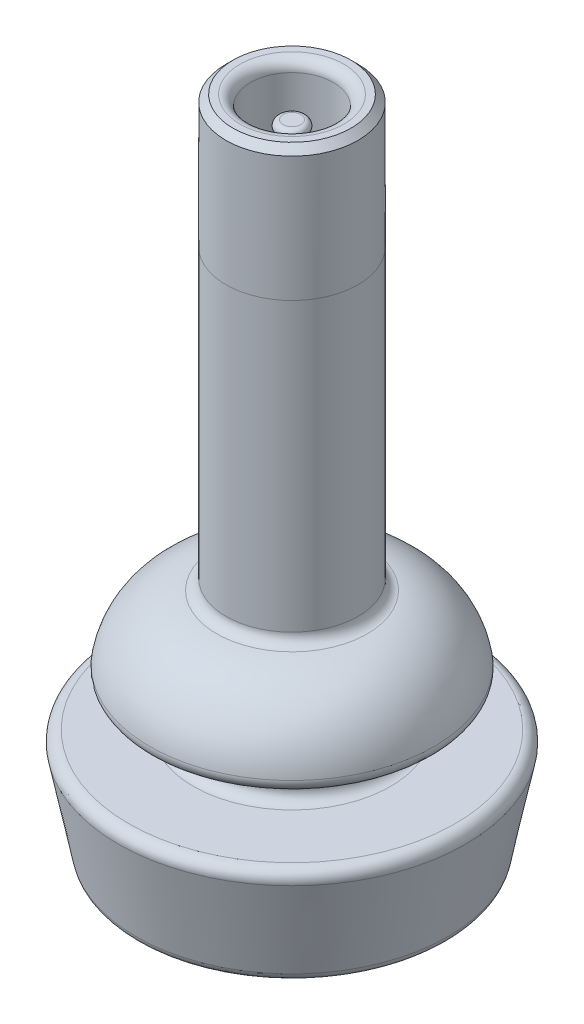
ISO-10303-21;
HEADER;
FILE_DESCRIPTION(('STEP AP214'),'2;1');
FILE_NAME('part.step','',(''),(''),'','','');
FILE_SCHEMA(('AUTOMOTIVE_DESIGN { 1 0 10303 214 1 1 1 1 }'));
ENDSEC;
DATA;
#1=APPLICATION_CONTEXT('core data for automotive mechanical design processes');
#2=APPLICATION_PROTOCOL_DEFINITION('international standard','automotive_design',2000,#1);
#3=PRODUCT_CONTEXT('',#1,'mechanical');
#4=PRODUCT('Part','Part','',(#3));
#5=PRODUCT_RELATED_PRODUCT_CATEGORY('part','',(#4));
#6=PRODUCT_DEFINITION_FORMATION('','',#4);
#7=PRODUCT_DEFINITION_CONTEXT('part definition',#1,'design');
#8=PRODUCT_DEFINITION('design','',#6,#7);
#9=PRODUCT_DEFINITION_SHAPE('','',#8);
#10=(LENGTH_UNIT() NAMED_UNIT(*) SI_UNIT(.MILLI.,.METRE.));
#11=(NAMED_UNIT(*) PLANE_ANGLE_UNIT() SI_UNIT($,.RADIAN.));
#12=(NAMED_UNIT(*) SI_UNIT($,.STERADIAN.) SOLID_ANGLE_UNIT());
#13=UNCERTAINTY_MEASURE_WITH_UNIT(LENGTH_MEASURE(1.E-05),#10,'distance_accuracy_value','');
#14=(GEOMETRIC_REPRESENTATION_CONTEXT(3) GLOBAL_UNCERTAINTY_ASSIGNED_CONTEXT((#13)) GLOBAL_UNIT_ASSIGNED_CONTEXT((#10,
#11,#12)) REPRESENTATION_CONTEXT('',''));
#15=CARTESIAN_POINT('',(0.,0.,0.));
#16=DIRECTION('',(0.,0.,1.));
#17=DIRECTION('',(1.,0.,0.));
#18=AXIS2_PLACEMENT_3D('',#15,#16,#17);
#19=CARTESIAN_POINT('',(0.,45.6565,0.));
#20=DIRECTION('',(0.,-1.,0.));
#21=DIRECTION('',(0.,0.,-1.));
#22=AXIS2_PLACEMENT_3D('',#19,#20,#21);
#23=TOROIDAL_SURFACE('',#22,0.635,0.381000000000002);
#24=CARTESIAN_POINT('',(0.,46.0375,0.));
#25=DIRECTION('',(0.,-1.,0.));
#26=DIRECTION('',(0.,0.,-1.));
#27=AXIS2_PLACEMENT_3D('',#24,#25,#26);
#28=CIRCLE('',#27,0.635);
#29=CARTESIAN_POINT('',(0.,46.0375,-0.635));
#30=VERTEX_POINT('',#29);
#31=EDGE_CURVE('E74',#30,#30,#28,.T.);
#32=ORIENTED_EDGE('',*,*,#31,.T.);
#33=EDGE_LOOP('',(#32));
#34=FACE_BOUND('',#33,.T.);
#35=CARTESIAN_POINT('',(0.,45.3419218069755,0.));
#36=DIRECTION('',(0.,-1.,0.));
#37=DIRECTION('',(0.,0.,-1.));
#38=AXIS2_PLACEMENT_3D('',#35,#36,#37);
#39=CIRCLE('',#38,0.849945482561182);
#40=CARTESIAN_POINT('',(0.,45.3419218069755,-0.849945482561182));
#41=VERTEX_POINT('',#40);
#42=EDGE_CURVE('E68',#41,#41,#39,.T.);
#43=ORIENTED_EDGE('',*,*,#42,.F.);
#44=EDGE_LOOP('',(#43));
#45=FACE_BOUND('',#44,.T.);
#46=ADVANCED_FACE('F45',(#34,#45),#23,.T.);
#47=CARTESIAN_POINT('',(0.,45.0215,0.));
#48=DIRECTION('',(0.,1.,0.));
#49=DIRECTION('',(0.,0.,1.));
#50=AXIS2_PLACEMENT_3D('',#47,#48,#49);
#51=CONICAL_SURFACE('',#50,0.381,0.971379127257785);
#52=ORIENTED_EDGE('',*,*,#42,.T.);
#53=EDGE_LOOP('',(#52));
#54=FACE_BOUND('',#53,.T.);
#55=CARTESIAN_POINT('',(0.,45.0215,0.));
#56=DIRECTION('',(0.,-1.,0.));
#57=DIRECTION('',(0.,0.,-1.));
#58=AXIS2_PLACEMENT_3D('',#55,#56,#57);
#59=CIRCLE('',#58,0.381);
#60=CARTESIAN_POINT('',(0.,45.0215,-0.381));
#61=VERTEX_POINT('',#60);
#62=EDGE_CURVE('E71',#61,#61,#59,.T.);
#63=ORIENTED_EDGE('',*,*,#62,.F.);
#64=EDGE_LOOP('',(#63));
#65=FACE_BOUND('',#64,.T.);
#66=ADVANCED_FACE('F102',(#54,#65),#51,.T.);
#67=CARTESIAN_POINT('',(0.,38.1,0.));
#68=DIRECTION('',(0.,-1.,0.));
#69=DIRECTION('',(0.,0.,-1.));
#70=AXIS2_PLACEMENT_3D('',#67,#68,#69);
#71=CYLINDRICAL_SURFACE('',#70,0.381);
#72=CARTESIAN_POINT('',(0.,38.862,0.));
#73=DIRECTION('',(0.,1.,0.));
#74=DIRECTION('',(0.,0.,1.));
#75=AXIS2_PLACEMENT_3D('',#72,#73,#74);
#76=CIRCLE('',#75,0.381);
#77=CARTESIAN_POINT('',(0.,38.862,0.381));
#78=VERTEX_POINT('',#77);
#79=EDGE_CURVE('E65',#78,#78,#76,.F.);
#80=ORIENTED_EDGE('',*,*,#79,.F.);
#81=EDGE_LOOP('',(#80));
#82=FACE_BOUND('',#81,.T.);
#83=ORIENTED_EDGE('',*,*,#62,.T.);
#84=EDGE_LOOP('',(#83));
#85=FACE_BOUND('',#84,.T.);
#86=ADVANCED_FACE('F108',(#82,#85),#71,.T.);
#87=CARTESIAN_POINT('',(0.,46.0375,0.));
#88=DIRECTION('',(0.,1.,0.));
#89=DIRECTION('',(0.,0.,1.));
#90=AXIS2_PLACEMENT_3D('',#87,#88,#89);
#91=PLANE('',#90);
#92=ORIENTED_EDGE('',*,*,#31,.F.);
#93=EDGE_LOOP('',(#92));
#94=FACE_BOUND('',#93,.T.);
#95=ADVANCED_FACE('F137',(#94),#91,.T.);
#96=CARTESIAN_POINT('',(1.7145,38.862,0.));
#97=DIRECTION('',(0.,1.,0.));
#98=DIRECTION('',(0.,0.,1.));
#99=AXIS2_PLACEMENT_3D('',#96,#97,#98);
#100=PLANE('',#99);
#101=ORIENTED_EDGE('',*,*,#79,.T.);
#102=EDGE_LOOP('',(#101));
#103=FACE_BOUND('',#102,.T.);
#104=CARTESIAN_POINT('',(0.,38.862,0.));
#105=DIRECTION('',(0.,-1.,0.));
#106=DIRECTION('',(0.,0.,-1.));
#107=AXIS2_PLACEMENT_3D('',#104,#105,#106);
#108=CIRCLE('',#107,1.7145);
#109=CARTESIAN_POINT('',(0.,38.862,-1.7145));
#110=VERTEX_POINT('',#109);
#111=EDGE_CURVE('E77',#110,#110,#108,.T.);
#112=ORIENTED_EDGE('',*,*,#111,.F.);
#113=EDGE_LOOP('',(#112));
#114=FACE_BOUND('',#113,.T.);
#115=ADVANCED_FACE('F131',(#103,#114),#100,.T.);
#116=CARTESIAN_POINT('',(0.,40.132,0.));
#117=DIRECTION('',(0.,-1.,0.));
#118=DIRECTION('',(0.,0.,-1.));
#119=AXIS2_PLACEMENT_3D('',#116,#117,#118);
#120=TOROIDAL_SURFACE('',#119,1.7145,1.27);
#121=ORIENTED_EDGE('',*,*,#111,.T.);
#122=EDGE_LOOP('',(#121));
#123=FACE_BOUND('',#122,.T.);
#124=CARTESIAN_POINT('',(0.,40.132,0.));
#125=DIRECTION('',(0.,-1.,0.));
#126=DIRECTION('',(0.,0.,-1.));
#127=AXIS2_PLACEMENT_3D('',#124,#125,#126);
#128=CIRCLE('',#127,2.9845);
#129=CARTESIAN_POINT('',(0.,40.132,-2.9845));
#130=VERTEX_POINT('',#129);
#131=EDGE_CURVE('E80',#130,#130,#128,.T.);
#132=ORIENTED_EDGE('',*,*,#131,.F.);
#133=EDGE_LOOP('',(#132));
#134=FACE_BOUND('',#133,.T.);
#135=ADVANCED_FACE('F126',(#123,#134),#120,.F.);
#136=CARTESIAN_POINT('',(0.,0.,0.));
#137=DIRECTION('',(0.,-1.,0.));
#138=DIRECTION('',(0.,0.,-1.));
#139=AXIS2_PLACEMENT_3D('',#136,#137,#138);
#140=CYLINDRICAL_SURFACE('',#139,2.9845);
#141=CARTESIAN_POINT('',(0.,46.863,0.));
#142=DIRECTION('',(0.,1.,0.));
#143=DIRECTION('',(0.,0.,1.));
#144=AXIS2_PLACEMENT_3D('',#141,#142,#143);
#145=CIRCLE('',#144,2.9845);
#146=CARTESIAN_POINT('',(0.,46.863,2.9845));
#147=VERTEX_POINT('',#146);
#148=EDGE_CURVE('E56',#147,#147,#145,.T.);
#149=ORIENTED_EDGE('',*,*,#148,.T.);
#150=EDGE_LOOP('',(#149));
#151=FACE_BOUND('',#150,.T.);
#152=ORIENTED_EDGE('',*,*,#131,.T.);
#153=EDGE_LOOP('',(#152));
#154=FACE_BOUND('',#153,.T.);
#155=ADVANCED_FACE('F99',(#151,#154),#140,.F.);
#156=CARTESIAN_POINT('',(4.7625,47.625,0.));
#157=DIRECTION('',(0.,1.,0.));
#158=DIRECTION('',(0.,0.,1.));
#159=AXIS2_PLACEMENT_3D('',#156,#157,#158);
#160=PLANE('',#159);
#161=CARTESIAN_POINT('',(0.,47.625,0.));
#162=DIRECTION('',(0.,1.,0.));
#163=DIRECTION('',(0.,0.,1.));
#164=AXIS2_PLACEMENT_3D('',#161,#162,#163);
#165=CIRCLE('',#164,4.2545);
#166=CARTESIAN_POINT('',(0.,47.625,4.2545));
#167=VERTEX_POINT('',#166);
#168=EDGE_CURVE('E11',#167,#167,#165,.T.);
#169=ORIENTED_EDGE('',*,*,#168,.T.);
#170=EDGE_LOOP('',(#169));
#171=FACE_BOUND('',#170,.T.);
#172=CARTESIAN_POINT('',(0.,47.625,0.));
#173=DIRECTION('',(0.,1.,0.));
#174=DIRECTION('',(0.,0.,1.));
#175=AXIS2_PLACEMENT_3D('',#172,#173,#174);
#176=CIRCLE('',#175,3.7465);
#177=CARTESIAN_POINT('',(0.,47.625,3.7465));
#178=VERTEX_POINT('',#177);
#179=EDGE_CURVE('E60',#178,#178,#176,.F.);
#180=ORIENTED_EDGE('',*,*,#179,.T.);
#181=EDGE_LOOP('',(#180));
#182=FACE_BOUND('',#181,.T.);
#183=ADVANCED_FACE('F91',(#171,#182),#160,.T.);
#184=CARTESIAN_POINT('',(0.,0.,0.));
#185=DIRECTION('',(0.,-1.,0.));
#186=DIRECTION('',(0.,0.,-1.));
#187=AXIS2_PLACEMENT_3D('',#184,#185,#186);
#188=CYLINDRICAL_SURFACE('',#187,4.7625);
#189=CARTESIAN_POINT('',(0.,47.117,0.));
#190=DIRECTION('',(0.,1.,0.));
#191=DIRECTION('',(0.,0.,1.));
#192=AXIS2_PLACEMENT_3D('',#189,#190,#191);
#193=CIRCLE('',#192,4.7625);
#194=CARTESIAN_POINT('',(0.,47.117,4.7625));
#195=VERTEX_POINT('',#194);
#196=EDGE_CURVE('E52',#195,#195,#193,.F.);
#197=ORIENTED_EDGE('',*,*,#196,.T.);
#198=EDGE_LOOP('',(#197));
#199=FACE_BOUND('',#198,.T.);
#200=CARTESIAN_POINT('',(0.,38.1,0.));
#201=DIRECTION('',(0.,-1.,0.));
#202=DIRECTION('',(0.,0.,-1.));
#203=AXIS2_PLACEMENT_3D('',#200,#201,#202);
#204=CIRCLE('',#203,4.7625);
#205=CARTESIAN_POINT('',(0.,38.1,-4.7625));
#206=VERTEX_POINT('',#205);
#207=EDGE_CURVE('E83',#206,#206,#204,.T.);
#208=ORIENTED_EDGE('',*,*,#207,.F.);
#209=EDGE_LOOP('',(#208));
#210=FACE_BOUND('',#209,.T.);
#211=ADVANCED_FACE('F89',(#199,#210),#188,.T.);
#212=CARTESIAN_POINT('',(0.381000000000001,38.1,0.));
#213=DIRECTION('',(0.,-1.,0.));
#214=DIRECTION('',(0.,0.,-1.));
#215=AXIS2_PLACEMENT_3D('',#212,#213,#214);
#216=PLANE('',#215);
#217=ORIENTED_EDGE('',*,*,#207,.T.);
#218=EDGE_LOOP('',(#217));
#219=FACE_BOUND('',#218,.T.);
#220=ADVANCED_FACE('F87',(#219),#216,.T.);
#221=CARTESIAN_POINT('',(0.,46.863,0.));
#222=DIRECTION('',(0.,1.,0.));
#223=DIRECTION('',(0.,0.,1.));
#224=AXIS2_PLACEMENT_3D('',#221,#222,#223);
#225=TOROIDAL_SURFACE('',#224,3.7465,0.762);
#226=ORIENTED_EDGE('',*,*,#148,.F.);
#227=EDGE_LOOP('',(#226));
#228=FACE_BOUND('',#227,.T.);
#229=ORIENTED_EDGE('',*,*,#179,.F.);
#230=EDGE_LOOP('',(#229));
#231=FACE_BOUND('',#230,.T.);
#232=ADVANCED_FACE('F97',(#228,#231),#225,.T.);
#233=CARTESIAN_POINT('',(0.,47.117,0.));
#234=DIRECTION('',(0.,-1.,0.));
#235=DIRECTION('',(0.,0.,-1.));
#236=AXIS2_PLACEMENT_3D('',#233,#234,#235);
#237=CONICAL_SURFACE('',#236,4.7625,0.785398163397452);
#238=ORIENTED_EDGE('',*,*,#168,.F.);
#239=EDGE_LOOP('',(#238));
#240=FACE_BOUND('',#239,.T.);
#241=ORIENTED_EDGE('',*,*,#196,.F.);
#242=EDGE_LOOP('',(#241));
#243=FACE_BOUND('',#242,.T.);
#244=ADVANCED_FACE('F47',(#240,#243),#237,.T.);
#245=CLOSED_SHELL('',(#46,#66,#86,#95,#115,#135,#155,#183,#211,#220,#232,#244));
#246=MANIFOLD_SOLID_BREP('B2',#245);
#247=CARTESIAN_POINT('',(0.,38.1,0.));
#248=DIRECTION('',(0.,1.,0.));
#249=DIRECTION('',(0.,0.,1.));
#250=AXIS2_PLACEMENT_3D('',#247,#248,#249);
#251=PLANE('',#250);
#252=CARTESIAN_POINT('',(0.,38.1,0.));
#253=DIRECTION('',(0.,-1.,0.));
#254=DIRECTION('',(0.,0.,-1.));
#255=AXIS2_PLACEMENT_3D('',#252,#253,#254);
#256=CIRCLE('',#255,4.7625);
#257=CARTESIAN_POINT('',(0.,38.1,-4.7625));
#258=VERTEX_POINT('',#257);
#259=EDGE_CURVE('E283',#258,#258,#256,.T.);
#260=ORIENTED_EDGE('',*,*,#259,.F.);
#261=EDGE_LOOP('',(#260));
#262=FACE_BOUND('',#261,.T.);
#263=ADVANCED_FACE('F239',(#262),#251,.T.);
#264=CARTESIAN_POINT('',(0.,0.,0.));
#265=DIRECTION('',(0.,-1.,0.));
#266=DIRECTION('',(0.,0.,-1.));
#267=AXIS2_PLACEMENT_3D('',#264,#265,#266);
#268=CYLINDRICAL_SURFACE('',#267,4.7625);
#269=CARTESIAN_POINT('',(0.,17.3846319391814,0.));
#270=DIRECTION('',(0.,-1.,0.));
#271=DIRECTION('',(0.,0.,-1.));
#272=AXIS2_PLACEMENT_3D('',#269,#270,#271);
#273=CIRCLE('',#272,4.7625);
#274=CARTESIAN_POINT('',(0.,17.3846319391814,-4.7625));
#275=VERTEX_POINT('',#274);
#276=EDGE_CURVE('E254',#275,#275,#273,.F.);
#277=ORIENTED_EDGE('',*,*,#276,.T.);
#278=EDGE_LOOP('',(#277));
#279=FACE_BOUND('',#278,.T.);
#280=ORIENTED_EDGE('',*,*,#259,.T.);
#281=EDGE_LOOP('',(#280));
#282=FACE_BOUND('',#281,.T.);
#283=ADVANCED_FACE('F287',(#279,#282),#268,.T.);
#284=CARTESIAN_POINT('',(0.,11.1125,0.));
#285=DIRECTION('',(0.,-1.,0.));
#286=DIRECTION('',(0.,0.,-1.));
#287=AXIS2_PLACEMENT_3D('',#284,#285,#286);
#288=DEGENERATE_TOROIDAL_SURFACE('',#287,4.7625,5.55625,.T.);
#289=CARTESIAN_POINT('',(0.,16.6281939163656,0.));
#290=DIRECTION('',(0.,-1.,0.));
#291=DIRECTION('',(0.,0.,-1.));
#292=AXIS2_PLACEMENT_3D('',#289,#290,#291);
#293=CIRCLE('',#292,5.43260050251257);
#294=CARTESIAN_POINT('',(0.,16.6281939163656,-5.43260050251257));
#295=VERTEX_POINT('',#294);
#296=EDGE_CURVE('E259',#295,#295,#293,.T.);
#297=ORIENTED_EDGE('',*,*,#296,.T.);
#298=EDGE_LOOP('',(#297));
#299=FACE_BOUND('',#298,.T.);
#300=CARTESIAN_POINT('',(0.,11.9956125827815,0.));
#301=DIRECTION('',(0.,-1.,0.));
#302=DIRECTION('',(0.,0.,-1.));
#303=AXIS2_PLACEMENT_3D('',#300,#301,#302);
#304=CIRCLE('',#303,10.2481199493433);
#305=CARTESIAN_POINT('',(0.,11.9956125827815,-10.2481199493433));
#306=VERTEX_POINT('',#305);
#307=EDGE_CURVE('E262',#306,#306,#304,.F.);
#308=ORIENTED_EDGE('',*,*,#307,.T.);
#309=EDGE_LOOP('',(#308));
#310=FACE_BOUND('',#309,.T.);
#311=ADVANCED_FACE('F294',(#299,#310),#288,.T.);
#312=CARTESIAN_POINT('',(10.31875,11.1125,0.));
#313=DIRECTION('',(0.,-1.,0.));
#314=DIRECTION('',(0.,0.,-1.));
#315=AXIS2_PLACEMENT_3D('',#312,#313,#314);
#316=PLANE('',#315);
#317=CARTESIAN_POINT('',(0.,11.1125,0.));
#318=DIRECTION('',(0.,-1.,0.));
#319=DIRECTION('',(0.,0.,-1.));
#320=AXIS2_PLACEMENT_3D('',#317,#318,#319);
#321=CIRCLE('',#320,7.112);
#322=CARTESIAN_POINT('',(0.,11.1125,-7.112));
#323=VERTEX_POINT('',#322);
#324=EDGE_CURVE('E271',#323,#323,#321,.F.);
#325=ORIENTED_EDGE('',*,*,#324,.T.);
#326=EDGE_LOOP('',(#325));
#327=FACE_BOUND('',#326,.T.);
#328=CARTESIAN_POINT('',(0.,11.1125,0.));
#329=DIRECTION('',(0.,-1.,0.));
#330=DIRECTION('',(0.,0.,-1.));
#331=AXIS2_PLACEMENT_3D('',#328,#329,#330);
#332=CIRCLE('',#331,9.49580635629049);
#333=CARTESIAN_POINT('',(0.,11.1125,-9.49580635629049));
#334=VERTEX_POINT('',#333);
#335=EDGE_CURVE('E274',#334,#334,#332,.T.);
#336=ORIENTED_EDGE('',*,*,#335,.T.);
#337=EDGE_LOOP('',(#336));
#338=FACE_BOUND('',#337,.T.);
#339=ADVANCED_FACE('F336',(#327,#338),#316,.T.);
#340=CARTESIAN_POINT('',(0.,0.,0.));
#341=DIRECTION('',(0.,-1.,0.));
#342=DIRECTION('',(0.,0.,-1.));
#343=AXIS2_PLACEMENT_3D('',#340,#341,#342);
#344=CYLINDRICAL_SURFACE('',#343,6.35);
#345=CARTESIAN_POINT('',(0.,10.3505,0.));
#346=DIRECTION('',(0.,-1.,0.));
#347=DIRECTION('',(0.,0.,-1.));
#348=AXIS2_PLACEMENT_3D('',#345,#346,#347);
#349=CIRCLE('',#348,6.35);
#350=CARTESIAN_POINT('',(0.,10.3505,-6.35));
#351=VERTEX_POINT('',#350);
#352=EDGE_CURVE('E277',#351,#351,#349,.T.);
#353=ORIENTED_EDGE('',*,*,#352,.T.);
#354=EDGE_LOOP('',(#353));
#355=FACE_BOUND('',#354,.T.);
#356=CARTESIAN_POINT('',(0.,8.6995,0.));
#357=DIRECTION('',(0.,1.,0.));
#358=DIRECTION('',(0.,0.,1.));
#359=AXIS2_PLACEMENT_3D('',#356,#357,#358);
#360=CIRCLE('',#359,6.35);
#361=CARTESIAN_POINT('',(0.,8.6995,6.35));
#362=VERTEX_POINT('',#361);
#363=EDGE_CURVE('E280',#362,#362,#360,.T.);
#364=ORIENTED_EDGE('',*,*,#363,.T.);
#365=EDGE_LOOP('',(#364));
#366=FACE_BOUND('',#365,.T.);
#367=ADVANCED_FACE('F328',(#355,#366),#344,.T.);
#368=CARTESIAN_POINT('',(6.35,7.9375,0.));
#369=DIRECTION('',(0.,1.,0.));
#370=DIRECTION('',(0.,0.,1.));
#371=AXIS2_PLACEMENT_3D('',#368,#369,#370);
#372=PLANE('',#371);
#373=CARTESIAN_POINT('',(0.,7.9375,0.));
#374=DIRECTION('',(0.,1.,0.));
#375=DIRECTION('',(0.,0.,1.));
#376=AXIS2_PLACEMENT_3D('',#373,#374,#375);
#377=CIRCLE('',#376,7.112);
#378=CARTESIAN_POINT('',(0.,7.9375,7.112));
#379=VERTEX_POINT('',#378);
#380=EDGE_CURVE('E265',#379,#379,#377,.F.);
#381=ORIENTED_EDGE('',*,*,#380,.T.);
#382=EDGE_LOOP('',(#381));
#383=FACE_BOUND('',#382,.T.);
#384=CARTESIAN_POINT('',(0.,7.9375,0.));
#385=DIRECTION('',(0.,1.,0.));
#386=DIRECTION('',(0.,0.,1.));
#387=AXIS2_PLACEMENT_3D('',#384,#385,#386);
#388=CIRCLE('',#387,11.7705094261285);
#389=CARTESIAN_POINT('',(0.,7.9375,11.7705094261285));
#390=VERTEX_POINT('',#389);
#391=EDGE_CURVE('E268',#390,#390,#388,.T.);
#392=ORIENTED_EDGE('',*,*,#391,.T.);
#393=EDGE_LOOP('',(#392));
#394=FACE_BOUND('',#393,.T.);
#395=ADVANCED_FACE('F325',(#383,#394),#372,.T.);
#396=CARTESIAN_POINT('',(0.,0.,0.));
#397=DIRECTION('',(0.,1.,0.));
#398=DIRECTION('',(0.,0.,1.));
#399=AXIS2_PLACEMENT_3D('',#396,#397,#398);
#400=CONICAL_SURFACE('',#399,11.1125,0.197395559849881);
#401=CARTESIAN_POINT('',(0.,0.612559505024708,0.));
#402=DIRECTION('',(0.,-1.,0.));
#403=DIRECTION('',(0.,0.,-1.));
#404=AXIS2_PLACEMENT_3D('',#401,#402,#403);
#405=CIRCLE('',#404,11.2350119010049);
#406=CARTESIAN_POINT('',(0.,0.612559505024708,-11.2350119010049));
#407=VERTEX_POINT('',#406);
#408=EDGE_CURVE('E44',#407,#407,#405,.F.);
#409=ORIENTED_EDGE('',*,*,#408,.T.);
#410=EDGE_LOOP('',(#409));
#411=FACE_BOUND('',#410,.T.);
#412=CARTESIAN_POINT('',(0.,7.02605950502471,0.));
#413=DIRECTION('',(0.,-1.,0.));
#414=DIRECTION('',(0.,0.,-1.));
#415=AXIS2_PLACEMENT_3D('',#412,#413,#414);
#416=CIRCLE('',#415,12.5177119010049);
#417=CARTESIAN_POINT('',(0.,7.02605950502471,-12.5177119010049));
#418=VERTEX_POINT('',#417);
#419=EDGE_CURVE('E246',#418,#418,#416,.T.);
#420=ORIENTED_EDGE('',*,*,#419,.T.);
#421=EDGE_LOOP('',(#420));
#422=FACE_BOUND('',#421,.T.);
#423=ADVANCED_FACE('F327',(#411,#422),#400,.T.);
#424=CARTESIAN_POINT('',(11.1125,0.,0.));
#425=DIRECTION('',(0.,-1.,0.));
#426=DIRECTION('',(0.,0.,-1.));
#427=AXIS2_PLACEMENT_3D('',#424,#425,#426);
#428=PLANE('',#427);
#429=CARTESIAN_POINT('',(0.,0.,0.));
#430=DIRECTION('',(0.,-1.,0.));
#431=DIRECTION('',(0.,0.,-1.));
#432=AXIS2_PLACEMENT_3D('',#429,#430,#431);
#433=CIRCLE('',#432,10.4878094261285);
#434=CARTESIAN_POINT('',(0.,0.,-10.4878094261285));
#435=VERTEX_POINT('',#434);
#436=EDGE_CURVE('E250',#435,#435,#433,.T.);
#437=ORIENTED_EDGE('',*,*,#436,.T.);
#438=EDGE_LOOP('',(#437));
#439=FACE_BOUND('',#438,.T.);
#440=ADVANCED_FACE('F303',(#439),#428,.T.);
#441=CARTESIAN_POINT('',(0.,10.3505,0.));
#442=DIRECTION('',(0.,-1.,0.));
#443=DIRECTION('',(0.,0.,-1.));
#444=AXIS2_PLACEMENT_3D('',#441,#442,#443);
#445=TOROIDAL_SURFACE('',#444,7.112,0.762);
#446=ORIENTED_EDGE('',*,*,#324,.F.);
#447=EDGE_LOOP('',(#446));
#448=FACE_BOUND('',#447,.T.);
#449=ORIENTED_EDGE('',*,*,#352,.F.);
#450=EDGE_LOOP('',(#449));
#451=FACE_BOUND('',#450,.T.);
#452=ADVANCED_FACE('F299',(#448,#451),#445,.F.);
#453=CARTESIAN_POINT('',(0.,8.6995,0.));
#454=DIRECTION('',(0.,1.,0.));
#455=DIRECTION('',(0.,0.,1.));
#456=AXIS2_PLACEMENT_3D('',#453,#454,#455);
#457=TOROIDAL_SURFACE('',#456,7.112,0.762);
#458=ORIENTED_EDGE('',*,*,#363,.F.);
#459=EDGE_LOOP('',(#458));
#460=FACE_BOUND('',#459,.T.);
#461=ORIENTED_EDGE('',*,*,#380,.F.);
#462=EDGE_LOOP('',(#461));
#463=FACE_BOUND('',#462,.T.);
#464=ADVANCED_FACE('F302',(#460,#463),#457,.F.);
#465=CARTESIAN_POINT('',(0.,17.3846319391814,0.));
#466=DIRECTION('',(0.,-1.,0.));
#467=DIRECTION('',(0.,0.,-1.));
#468=AXIS2_PLACEMENT_3D('',#465,#466,#467);
#469=TOROIDAL_SURFACE('',#468,5.5245,0.762);
#470=ORIENTED_EDGE('',*,*,#276,.F.);
#471=EDGE_LOOP('',(#470));
#472=FACE_BOUND('',#471,.T.);
#473=ORIENTED_EDGE('',*,*,#296,.F.);
#474=EDGE_LOOP('',(#473));
#475=FACE_BOUND('',#474,.T.);
#476=ADVANCED_FACE('F307',(#472,#475),#469,.F.);
#477=CARTESIAN_POINT('',(0.,0.762,0.));
#478=DIRECTION('',(0.,-1.,0.));
#479=DIRECTION('',(0.,0.,-1.));
#480=AXIS2_PLACEMENT_3D('',#477,#478,#479);
#481=TOROIDAL_SURFACE('',#480,10.4878094261285,0.762);
#482=ORIENTED_EDGE('',*,*,#408,.F.);
#483=EDGE_LOOP('',(#482));
#484=FACE_BOUND('',#483,.T.);
#485=ORIENTED_EDGE('',*,*,#436,.F.);
#486=EDGE_LOOP('',(#485));
#487=FACE_BOUND('',#486,.T.);
#488=ADVANCED_FACE('F311',(#484,#487),#481,.T.);
#489=CARTESIAN_POINT('',(0.,7.1755,0.));
#490=DIRECTION('',(0.,1.,0.));
#491=DIRECTION('',(0.,0.,1.));
#492=AXIS2_PLACEMENT_3D('',#489,#490,#491);
#493=TOROIDAL_SURFACE('',#492,11.7705094261285,0.762);
#494=ORIENTED_EDGE('',*,*,#391,.F.);
#495=EDGE_LOOP('',(#494));
#496=FACE_BOUND('',#495,.T.);
#497=ORIENTED_EDGE('',*,*,#419,.F.);
#498=EDGE_LOOP('',(#497));
#499=FACE_BOUND('',#498,.T.);
#500=ADVANCED_FACE('F314',(#496,#499),#493,.T.);
#501=CARTESIAN_POINT('',(0.,11.8745,0.));
#502=DIRECTION('',(0.,-1.,0.));
#503=DIRECTION('',(0.,0.,-1.));
#504=AXIS2_PLACEMENT_3D('',#501,#502,#503);
#505=TOROIDAL_SURFACE('',#504,9.49580635629049,0.762);
#506=ORIENTED_EDGE('',*,*,#307,.F.);
#507=EDGE_LOOP('',(#506));
#508=FACE_BOUND('',#507,.T.);
#509=ORIENTED_EDGE('',*,*,#335,.F.);
#510=EDGE_LOOP('',(#509));
#511=FACE_BOUND('',#510,.T.);
#512=ADVANCED_FACE('F241',(#508,#511),#505,.T.);
#513=CLOSED_SHELL('',(#263,#283,#311,#339,#367,#395,#423,#440,#452,#464,#476,#488,#500,#512));
#514=MANIFOLD_SOLID_BREP('B6',#513);
#515=ADVANCED_BREP_SHAPE_REPRESENTATION('',(#18,#246,#514),#14);
#516=SHAPE_DEFINITION_REPRESENTATION(#9,#515);
ENDSEC;
END-ISO-10303-21;
